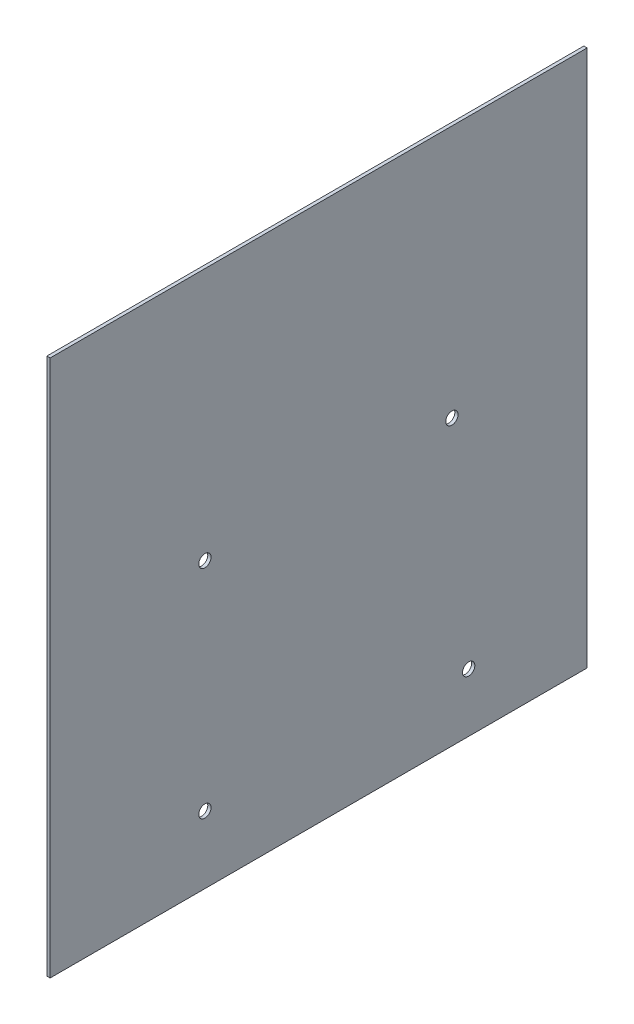
ISO-10303-21;
HEADER;
FILE_DESCRIPTION(('STEP AP214'),'2;1');
FILE_NAME('part.step','',(''),(''),'','','');
FILE_SCHEMA(('AUTOMOTIVE_DESIGN { 1 0 10303 214 1 1 1 1 }'));
ENDSEC;
DATA;
#1=APPLICATION_CONTEXT('core data for automotive mechanical design processes');
#2=APPLICATION_PROTOCOL_DEFINITION('international standard','automotive_design',2000,#1);
#3=PRODUCT_CONTEXT('',#1,'mechanical');
#4=PRODUCT('Part','Part','',(#3));
#5=PRODUCT_RELATED_PRODUCT_CATEGORY('part','',(#4));
#6=PRODUCT_DEFINITION_FORMATION('','',#4);
#7=PRODUCT_DEFINITION_CONTEXT('part definition',#1,'design');
#8=PRODUCT_DEFINITION('design','',#6,#7);
#9=PRODUCT_DEFINITION_SHAPE('','',#8);
#10=(LENGTH_UNIT() NAMED_UNIT(*) SI_UNIT(.MILLI.,.METRE.));
#11=(NAMED_UNIT(*) PLANE_ANGLE_UNIT() SI_UNIT($,.RADIAN.));
#12=(NAMED_UNIT(*) SI_UNIT($,.STERADIAN.) SOLID_ANGLE_UNIT());
#13=UNCERTAINTY_MEASURE_WITH_UNIT(LENGTH_MEASURE(1.E-05),#10,'distance_accuracy_value','');
#14=(GEOMETRIC_REPRESENTATION_CONTEXT(3) GLOBAL_UNCERTAINTY_ASSIGNED_CONTEXT((#13)) GLOBAL_UNIT_ASSIGNED_CONTEXT((#10,
#11,#12)) REPRESENTATION_CONTEXT('',''));
#15=CARTESIAN_POINT('',(0.,0.,0.));
#16=DIRECTION('',(0.,0.,1.));
#17=DIRECTION('',(1.,0.,0.));
#18=AXIS2_PLACEMENT_3D('',#15,#16,#17);
#19=CARTESIAN_POINT('',(0.8,65.4,-65.4));
#20=DIRECTION('',(0.,0.,1.));
#21=DIRECTION('',(1.,0.,0.));
#22=AXIS2_PLACEMENT_3D('',#19,#20,#21);
#23=PLANE('',#22);
#24=DIRECTION('',(0.,1.,0.));
#25=VECTOR('',#24,1.);
#26=CARTESIAN_POINT('',(0.,65.4,-65.4));
#27=LINE('',#26,#25);
#28=CARTESIAN_POINT('',(0.,-65.4,-65.4));
#29=VERTEX_POINT('',#28);
#30=CARTESIAN_POINT('',(0.,65.4,-65.4));
#31=VERTEX_POINT('',#30);
#32=EDGE_CURVE('E96',#29,#31,#27,.T.);
#33=ORIENTED_EDGE('',*,*,#32,.T.);
#34=DIRECTION('',(-1.,0.,0.));
#35=VECTOR('',#34,1.);
#36=CARTESIAN_POINT('',(0.8,65.4,-65.4));
#37=LINE('',#36,#35);
#38=CARTESIAN_POINT('',(0.8,65.4,-65.4));
#39=VERTEX_POINT('',#38);
#40=EDGE_CURVE('E11',#39,#31,#37,.T.);
#41=ORIENTED_EDGE('',*,*,#40,.F.);
#42=DIRECTION('',(0.,1.,0.));
#43=VECTOR('',#42,1.);
#44=CARTESIAN_POINT('',(0.8,65.4,-65.4));
#45=LINE('',#44,#43);
#46=CARTESIAN_POINT('',(0.8,-65.4,-65.4));
#47=VERTEX_POINT('',#46);
#48=EDGE_CURVE('E84',#47,#39,#45,.T.);
#49=ORIENTED_EDGE('',*,*,#48,.F.);
#50=DIRECTION('',(-1.,0.,0.));
#51=VECTOR('',#50,1.);
#52=CARTESIAN_POINT('',(0.8,-65.4,-65.4));
#53=LINE('',#52,#51);
#54=EDGE_CURVE('E92',#47,#29,#53,.T.);
#55=ORIENTED_EDGE('',*,*,#54,.T.);
#56=EDGE_LOOP('',(#33,#41,#49,#55));
#57=FACE_BOUND('',#56,.T.);
#58=ADVANCED_FACE('F33',(#57),#23,.F.);
#59=CARTESIAN_POINT('',(0.8,65.4,65.4));
#60=DIRECTION('',(0.,-1.,0.));
#61=DIRECTION('',(0.,0.,-1.));
#62=AXIS2_PLACEMENT_3D('',#59,#60,#61);
#63=PLANE('',#62);
#64=DIRECTION('',(0.,0.,1.));
#65=VECTOR('',#64,1.);
#66=CARTESIAN_POINT('',(0.,65.4,65.4));
#67=LINE('',#66,#65);
#68=CARTESIAN_POINT('',(0.,65.4,65.4));
#69=VERTEX_POINT('',#68);
#70=EDGE_CURVE('E88',#31,#69,#67,.T.);
#71=ORIENTED_EDGE('',*,*,#70,.T.);
#72=DIRECTION('',(-1.,0.,0.));
#73=VECTOR('',#72,1.);
#74=CARTESIAN_POINT('',(0.8,65.4,65.4));
#75=LINE('',#74,#73);
#76=CARTESIAN_POINT('',(0.8,65.4,65.4));
#77=VERTEX_POINT('',#76);
#78=EDGE_CURVE('E41',#77,#69,#75,.T.);
#79=ORIENTED_EDGE('',*,*,#78,.F.);
#80=DIRECTION('',(0.,0.,1.));
#81=VECTOR('',#80,1.);
#82=CARTESIAN_POINT('',(0.8,65.4,65.4));
#83=LINE('',#82,#81);
#84=EDGE_CURVE('E79',#39,#77,#83,.T.);
#85=ORIENTED_EDGE('',*,*,#84,.F.);
#86=ORIENTED_EDGE('',*,*,#40,.T.);
#87=EDGE_LOOP('',(#71,#79,#85,#86));
#88=FACE_BOUND('',#87,.T.);
#89=ADVANCED_FACE('F87',(#88),#63,.F.);
#90=CARTESIAN_POINT('',(0.8,65.4,65.4));
#91=DIRECTION('',(0.,0.,-1.));
#92=DIRECTION('',(0.,1.,0.));
#93=AXIS2_PLACEMENT_3D('',#90,#91,#92);
#94=PLANE('',#93);
#95=DIRECTION('',(0.,-1.,0.));
#96=VECTOR('',#95,1.);
#97=CARTESIAN_POINT('',(0.,65.4,65.4));
#98=LINE('',#97,#96);
#99=CARTESIAN_POINT('',(0.,-65.4,65.4));
#100=VERTEX_POINT('',#99);
#101=EDGE_CURVE('E66',#69,#100,#98,.T.);
#102=ORIENTED_EDGE('',*,*,#101,.T.);
#103=DIRECTION('',(-1.,0.,0.));
#104=VECTOR('',#103,1.);
#105=CARTESIAN_POINT('',(0.8,-65.4,65.4));
#106=LINE('',#105,#104);
#107=CARTESIAN_POINT('',(0.8,-65.4,65.4));
#108=VERTEX_POINT('',#107);
#109=EDGE_CURVE('E89',#108,#100,#106,.T.);
#110=ORIENTED_EDGE('',*,*,#109,.F.);
#111=DIRECTION('',(0.,-1.,0.));
#112=VECTOR('',#111,1.);
#113=CARTESIAN_POINT('',(0.8,65.4,65.4));
#114=LINE('',#113,#112);
#115=EDGE_CURVE('E82',#77,#108,#114,.T.);
#116=ORIENTED_EDGE('',*,*,#115,.F.);
#117=ORIENTED_EDGE('',*,*,#78,.T.);
#118=EDGE_LOOP('',(#102,#110,#116,#117));
#119=FACE_BOUND('',#118,.T.);
#120=ADVANCED_FACE('F90',(#119),#94,.F.);
#121=CARTESIAN_POINT('',(0.8,-65.4,65.4));
#122=DIRECTION('',(0.,1.,0.));
#123=DIRECTION('',(0.,0.,1.));
#124=AXIS2_PLACEMENT_3D('',#121,#122,#123);
#125=PLANE('',#124);
#126=DIRECTION('',(0.,0.,-1.));
#127=VECTOR('',#126,1.);
#128=CARTESIAN_POINT('',(0.,-65.4,65.4));
#129=LINE('',#128,#127);
#130=EDGE_CURVE('E72',#100,#29,#129,.T.);
#131=ORIENTED_EDGE('',*,*,#130,.T.);
#132=ORIENTED_EDGE('',*,*,#54,.F.);
#133=DIRECTION('',(0.,0.,-1.));
#134=VECTOR('',#133,1.);
#135=CARTESIAN_POINT('',(0.8,-65.4,65.4));
#136=LINE('',#135,#134);
#137=EDGE_CURVE('E49',#108,#47,#136,.T.);
#138=ORIENTED_EDGE('',*,*,#137,.F.);
#139=ORIENTED_EDGE('',*,*,#109,.T.);
#140=EDGE_LOOP('',(#131,#132,#138,#139));
#141=FACE_BOUND('',#140,.T.);
#142=ADVANCED_FACE('F104',(#141),#125,.F.);
#143=CARTESIAN_POINT('',(0.8,0.,0.));
#144=DIRECTION('',(1.,0.,0.));
#145=DIRECTION('',(0.,0.,-1.));
#146=AXIS2_PLACEMENT_3D('',#143,#144,#145);
#147=PLANE('',#146);
#148=CARTESIAN_POINT('',(0.8,3.78778226622397,-32.4667051390627));
#149=DIRECTION('',(1.,0.,0.));
#150=DIRECTION('',(0.,0.,-1.));
#151=AXIS2_PLACEMENT_3D('',#148,#149,#150);
#152=CIRCLE('',#151,1.5);
#153=CARTESIAN_POINT('',(0.8,3.78778226622397,-33.9667051390627));
#154=VERTEX_POINT('',#153);
#155=EDGE_CURVE('E115',#154,#154,#152,.F.);
#156=ORIENTED_EDGE('',*,*,#155,.T.);
#157=EDGE_LOOP('',(#156));
#158=FACE_BOUND('',#157,.T.);
#159=CARTESIAN_POINT('',(0.8,-49.0247247599847,27.7049217186669));
#160=DIRECTION('',(1.,0.,0.));
#161=DIRECTION('',(0.,0.,-1.));
#162=AXIS2_PLACEMENT_3D('',#159,#160,#161);
#163=CIRCLE('',#162,1.5);
#164=CARTESIAN_POINT('',(0.8,-49.0247247599847,26.2049217186669));
#165=VERTEX_POINT('',#164);
#166=EDGE_CURVE('E118',#165,#165,#163,.F.);
#167=ORIENTED_EDGE('',*,*,#166,.T.);
#168=EDGE_LOOP('',(#167));
#169=FACE_BOUND('',#168,.T.);
#170=CARTESIAN_POINT('',(0.8,-51.1891717692556,-36.5462714904942));
#171=DIRECTION('',(1.,0.,0.));
#172=DIRECTION('',(0.,0.,-1.));
#173=AXIS2_PLACEMENT_3D('',#170,#171,#172);
#174=CIRCLE('',#173,1.5);
#175=CARTESIAN_POINT('',(0.8,-51.1891717692556,-38.0462714904942));
#176=VERTEX_POINT('',#175);
#177=EDGE_CURVE('E121',#176,#176,#174,.F.);
#178=ORIENTED_EDGE('',*,*,#177,.T.);
#179=EDGE_LOOP('',(#178));
#180=FACE_BOUND('',#179,.T.);
#181=CARTESIAN_POINT('',(0.8,3.78778226622397,27.7049217186669));
#182=DIRECTION('',(1.,0.,0.));
#183=DIRECTION('',(0.,0.,-1.));
#184=AXIS2_PLACEMENT_3D('',#181,#182,#183);
#185=CIRCLE('',#184,1.5);
#186=CARTESIAN_POINT('',(0.8,3.78778226622397,26.2049217186669));
#187=VERTEX_POINT('',#186);
#188=EDGE_CURVE('E99',#187,#187,#185,.F.);
#189=ORIENTED_EDGE('',*,*,#188,.T.);
#190=EDGE_LOOP('',(#189));
#191=FACE_BOUND('',#190,.T.);
#192=ORIENTED_EDGE('',*,*,#48,.T.);
#193=ORIENTED_EDGE('',*,*,#84,.T.);
#194=ORIENTED_EDGE('',*,*,#115,.T.);
#195=ORIENTED_EDGE('',*,*,#137,.T.);
#196=EDGE_LOOP('',(#192,#193,#194,#195));
#197=FACE_BOUND('',#196,.T.);
#198=ADVANCED_FACE('F80',(#158,#169,#180,#191,#197),#147,.T.);
#199=CARTESIAN_POINT('',(0.,0.,0.));
#200=DIRECTION('',(1.,0.,0.));
#201=DIRECTION('',(0.,0.,-1.));
#202=AXIS2_PLACEMENT_3D('',#199,#200,#201);
#203=PLANE('',#202);
#204=CARTESIAN_POINT('',(0.,3.78778226622397,-32.4667051390627));
#205=DIRECTION('',(1.,0.,0.));
#206=DIRECTION('',(0.,0.,-1.));
#207=AXIS2_PLACEMENT_3D('',#204,#205,#206);
#208=CIRCLE('',#207,1.5);
#209=CARTESIAN_POINT('',(0.,3.78778226622397,-33.9667051390627));
#210=VERTEX_POINT('',#209);
#211=EDGE_CURVE('E124',#210,#210,#208,.T.);
#212=ORIENTED_EDGE('',*,*,#211,.T.);
#213=EDGE_LOOP('',(#212));
#214=FACE_BOUND('',#213,.T.);
#215=CARTESIAN_POINT('',(0.,-49.0247247599847,27.7049217186669));
#216=DIRECTION('',(1.,0.,0.));
#217=DIRECTION('',(0.,0.,-1.));
#218=AXIS2_PLACEMENT_3D('',#215,#216,#217);
#219=CIRCLE('',#218,1.5);
#220=CARTESIAN_POINT('',(0.,-49.0247247599847,26.2049217186669));
#221=VERTEX_POINT('',#220);
#222=EDGE_CURVE('E128',#221,#221,#219,.T.);
#223=ORIENTED_EDGE('',*,*,#222,.T.);
#224=EDGE_LOOP('',(#223));
#225=FACE_BOUND('',#224,.T.);
#226=CARTESIAN_POINT('',(0.,-51.1891717692556,-36.5462714904942));
#227=DIRECTION('',(1.,0.,0.));
#228=DIRECTION('',(0.,0.,-1.));
#229=AXIS2_PLACEMENT_3D('',#226,#227,#228);
#230=CIRCLE('',#229,1.5);
#231=CARTESIAN_POINT('',(0.,-51.1891717692556,-38.0462714904942));
#232=VERTEX_POINT('',#231);
#233=EDGE_CURVE('E125',#232,#232,#230,.T.);
#234=ORIENTED_EDGE('',*,*,#233,.T.);
#235=EDGE_LOOP('',(#234));
#236=FACE_BOUND('',#235,.T.);
#237=CARTESIAN_POINT('',(0.,3.78778226622397,27.7049217186669));
#238=DIRECTION('',(1.,0.,0.));
#239=DIRECTION('',(0.,0.,-1.));
#240=AXIS2_PLACEMENT_3D('',#237,#238,#239);
#241=CIRCLE('',#240,1.5);
#242=CARTESIAN_POINT('',(0.,3.78778226622397,26.2049217186669));
#243=VERTEX_POINT('',#242);
#244=EDGE_CURVE('E112',#243,#243,#241,.T.);
#245=ORIENTED_EDGE('',*,*,#244,.T.);
#246=EDGE_LOOP('',(#245));
#247=FACE_BOUND('',#246,.T.);
#248=ORIENTED_EDGE('',*,*,#32,.F.);
#249=ORIENTED_EDGE('',*,*,#130,.F.);
#250=ORIENTED_EDGE('',*,*,#101,.F.);
#251=ORIENTED_EDGE('',*,*,#70,.F.);
#252=EDGE_LOOP('',(#248,#249,#250,#251));
#253=FACE_BOUND('',#252,.T.);
#254=ADVANCED_FACE('F107',(#214,#225,#236,#247,#253),#203,.F.);
#255=CARTESIAN_POINT('',(10.,3.78778226622397,27.7049217186669));
#256=DIRECTION('',(-1.,0.,0.));
#257=DIRECTION('',(0.,0.,1.));
#258=AXIS2_PLACEMENT_3D('',#255,#256,#257);
#259=CYLINDRICAL_SURFACE('',#258,1.5);
#260=ORIENTED_EDGE('',*,*,#188,.F.);
#261=EDGE_LOOP('',(#260));
#262=FACE_BOUND('',#261,.T.);
#263=ORIENTED_EDGE('',*,*,#244,.F.);
#264=EDGE_LOOP('',(#263));
#265=FACE_BOUND('',#264,.T.);
#266=ADVANCED_FACE('F161',(#262,#265),#259,.F.);
#267=CARTESIAN_POINT('',(10.,-51.1891717692556,-36.5462714904942));
#268=DIRECTION('',(-1.,0.,0.));
#269=DIRECTION('',(0.,0.,1.));
#270=AXIS2_PLACEMENT_3D('',#267,#268,#269);
#271=CYLINDRICAL_SURFACE('',#270,1.5);
#272=ORIENTED_EDGE('',*,*,#177,.F.);
#273=EDGE_LOOP('',(#272));
#274=FACE_BOUND('',#273,.T.);
#275=ORIENTED_EDGE('',*,*,#233,.F.);
#276=EDGE_LOOP('',(#275));
#277=FACE_BOUND('',#276,.T.);
#278=ADVANCED_FACE('F144',(#274,#277),#271,.F.);
#279=CARTESIAN_POINT('',(10.,-49.0247247599847,27.7049217186669));
#280=DIRECTION('',(-1.,0.,0.));
#281=DIRECTION('',(0.,0.,1.));
#282=AXIS2_PLACEMENT_3D('',#279,#280,#281);
#283=CYLINDRICAL_SURFACE('',#282,1.5);
#284=ORIENTED_EDGE('',*,*,#166,.F.);
#285=EDGE_LOOP('',(#284));
#286=FACE_BOUND('',#285,.T.);
#287=ORIENTED_EDGE('',*,*,#222,.F.);
#288=EDGE_LOOP('',(#287));
#289=FACE_BOUND('',#288,.T.);
#290=ADVANCED_FACE('F138',(#286,#289),#283,.F.);
#291=CARTESIAN_POINT('',(10.,3.78778226622397,-32.4667051390627));
#292=DIRECTION('',(-1.,0.,0.));
#293=DIRECTION('',(0.,0.,1.));
#294=AXIS2_PLACEMENT_3D('',#291,#292,#293);
#295=CYLINDRICAL_SURFACE('',#294,1.5);
#296=ORIENTED_EDGE('',*,*,#155,.F.);
#297=EDGE_LOOP('',(#296));
#298=FACE_BOUND('',#297,.T.);
#299=ORIENTED_EDGE('',*,*,#211,.F.);
#300=EDGE_LOOP('',(#299));
#301=FACE_BOUND('',#300,.T.);
#302=ADVANCED_FACE('F136',(#298,#301),#295,.F.);
#303=CLOSED_SHELL('',(#58,#89,#120,#142,#198,#254,#266,#278,#290,#302));
#304=MANIFOLD_SOLID_BREP('B2',#303);
#305=ADVANCED_BREP_SHAPE_REPRESENTATION('',(#18,#304),#14);
#306=SHAPE_DEFINITION_REPRESENTATION(#9,#305);
ENDSEC;
END-ISO-10303-21;
